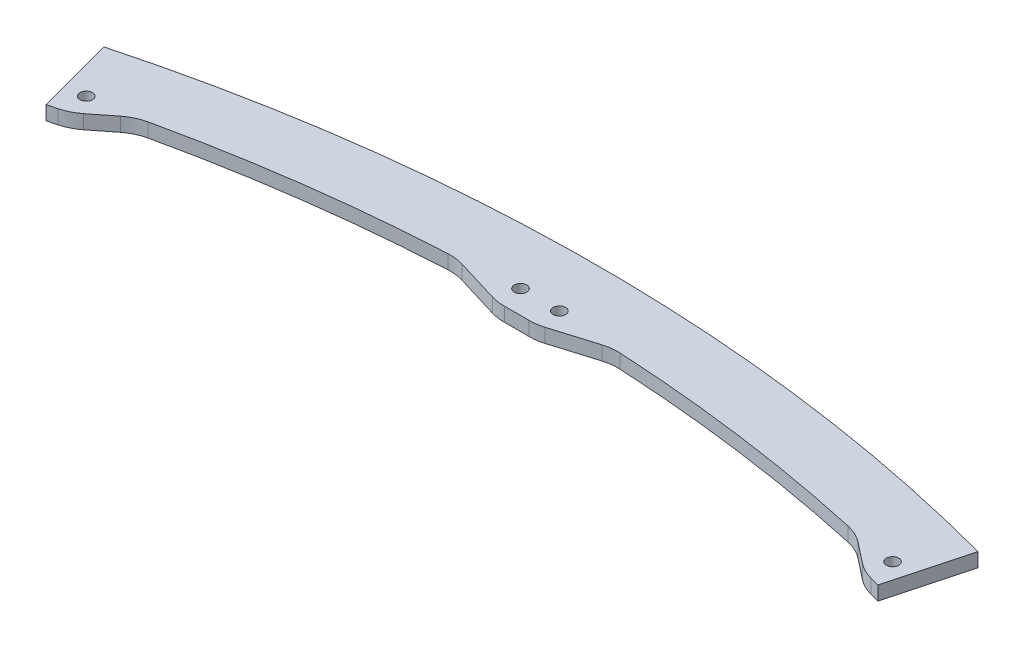
ISO-10303-21;
HEADER;
FILE_DESCRIPTION(('STEP AP214'),'2;1');
FILE_NAME('part.step','',(''),(''),'','','');
FILE_SCHEMA(('AUTOMOTIVE_DESIGN { 1 0 10303 214 1 1 1 1 }'));
ENDSEC;
DATA;
#1=APPLICATION_CONTEXT('core data for automotive mechanical design processes');
#2=APPLICATION_PROTOCOL_DEFINITION('international standard','automotive_design',2000,#1);
#3=PRODUCT_CONTEXT('',#1,'mechanical');
#4=PRODUCT('Part','Part','',(#3));
#5=PRODUCT_RELATED_PRODUCT_CATEGORY('part','',(#4));
#6=PRODUCT_DEFINITION_FORMATION('','',#4);
#7=PRODUCT_DEFINITION_CONTEXT('part definition',#1,'design');
#8=PRODUCT_DEFINITION('design','',#6,#7);
#9=PRODUCT_DEFINITION_SHAPE('','',#8);
#10=(LENGTH_UNIT() NAMED_UNIT(*) SI_UNIT(.MILLI.,.METRE.));
#11=(NAMED_UNIT(*) PLANE_ANGLE_UNIT() SI_UNIT($,.RADIAN.));
#12=(NAMED_UNIT(*) SI_UNIT($,.STERADIAN.) SOLID_ANGLE_UNIT());
#13=UNCERTAINTY_MEASURE_WITH_UNIT(LENGTH_MEASURE(1.E-05),#10,'distance_accuracy_value','');
#14=(GEOMETRIC_REPRESENTATION_CONTEXT(3) GLOBAL_UNCERTAINTY_ASSIGNED_CONTEXT((#13)) GLOBAL_UNIT_ASSIGNED_CONTEXT((#10,
#11,#12)) REPRESENTATION_CONTEXT('',''));
#15=CARTESIAN_POINT('',(0.,0.,0.));
#16=DIRECTION('',(0.,0.,1.));
#17=DIRECTION('',(1.,0.,0.));
#18=AXIS2_PLACEMENT_3D('',#15,#16,#17);
#19=CARTESIAN_POINT('',(0.,9.00000000000001,0.));
#20=DIRECTION('',(0.,-1.,0.));
#21=DIRECTION('',(0.,0.,-1.));
#22=AXIS2_PLACEMENT_3D('',#19,#20,#21);
#23=CYLINDRICAL_SURFACE('',#22,1045.);
#24=CARTESIAN_POINT('',(0.,0.,0.));
#25=DIRECTION('',(0.,1.,0.));
#26=DIRECTION('',(0.,0.,1.));
#27=AXIS2_PLACEMENT_3D('',#24,#25,#26);
#28=CIRCLE('',#27,1045.);
#29=CARTESIAN_POINT('',(224.875525166648,0.,-1020.51751488204));
#30=VERTEX_POINT('',#29);
#31=CARTESIAN_POINT('',(55.2967292869398,0.,-1043.53594654433));
#32=VERTEX_POINT('',#31);
#33=EDGE_CURVE('E271',#30,#32,#28,.T.);
#34=ORIENTED_EDGE('',*,*,#33,.F.);
#35=DIRECTION('',(0.,-1.,0.));
#36=VECTOR('',#35,1.);
#37=CARTESIAN_POINT('',(224.875525166648,9.00000000000001,-1020.51751488204));
#38=LINE('',#37,#36);
#39=CARTESIAN_POINT('',(224.875525166648,9.00000000000001,-1020.51751488204));
#40=VERTEX_POINT('',#39);
#41=EDGE_CURVE('E365',#30,#40,#38,.F.);
#42=ORIENTED_EDGE('',*,*,#41,.T.);
#43=CARTESIAN_POINT('',(0.,9.00000000000001,0.));
#44=DIRECTION('',(0.,1.,0.));
#45=DIRECTION('',(0.,0.,1.));
#46=AXIS2_PLACEMENT_3D('',#43,#44,#45);
#47=CIRCLE('',#46,1045.);
#48=CARTESIAN_POINT('',(55.2967292869398,9.00000000000001,-1043.53594654433));
#49=VERTEX_POINT('',#48);
#50=EDGE_CURVE('E321',#40,#49,#47,.T.);
#51=ORIENTED_EDGE('',*,*,#50,.T.);
#52=DIRECTION('',(0.,-1.,0.));
#53=VECTOR('',#52,1.);
#54=CARTESIAN_POINT('',(55.2967292869398,9.00000000000001,-1043.53594654433));
#55=LINE('',#54,#53);
#56=EDGE_CURVE('E361',#49,#32,#55,.T.);
#57=ORIENTED_EDGE('',*,*,#56,.T.);
#58=EDGE_LOOP('',(#34,#42,#51,#57));
#59=FACE_BOUND('',#58,.T.);
#60=ADVANCED_FACE('F51',(#59),#23,.F.);
#61=CARTESIAN_POINT('',(584.131477744867,9.00000000000001,-741.205658761959));
#62=DIRECTION('',(-0.618971116181871,0.,0.785413749136446));
#63=DIRECTION('',(0.785413749136446,0.,0.618971116181871));
#64=AXIS2_PLACEMENT_3D('',#61,#62,#63);
#65=PLANE('',#64);
#66=DIRECTION('',(-0.785413749136446,0.,-0.618971116181871));
#67=VECTOR('',#66,1.);
#68=CARTESIAN_POINT('',(584.131477744867,0.,-741.205658761959));
#69=LINE('',#68,#67);
#70=CARTESIAN_POINT('',(250.180034810631,0.,-1004.38706806479));
#71=VERTEX_POINT('',#70);
#72=CARTESIAN_POINT('',(236.988901948755,0.,-1014.78277381885));
#73=VERTEX_POINT('',#72);
#74=EDGE_CURVE('E272',#71,#73,#69,.T.);
#75=ORIENTED_EDGE('',*,*,#74,.F.);
#76=DIRECTION('',(0.,1.,0.));
#77=VECTOR('',#76,1.);
#78=CARTESIAN_POINT('',(250.180034810631,9.00000000000001,-1004.38706806479));
#79=LINE('',#78,#77);
#80=CARTESIAN_POINT('',(250.180034810631,9.00000000000001,-1004.38706806479));
#81=VERTEX_POINT('',#80);
#82=EDGE_CURVE('E348',#71,#81,#79,.T.);
#83=ORIENTED_EDGE('',*,*,#82,.T.);
#84=DIRECTION('',(-0.785413749136446,0.,-0.618971116181871));
#85=VECTOR('',#84,1.);
#86=CARTESIAN_POINT('',(584.131477744867,9.00000000000001,-741.205658761959));
#87=LINE('',#86,#85);
#88=CARTESIAN_POINT('',(236.988901948755,9.00000000000001,-1014.78277381885));
#89=VERTEX_POINT('',#88);
#90=EDGE_CURVE('E202',#81,#89,#87,.T.);
#91=ORIENTED_EDGE('',*,*,#90,.T.);
#92=DIRECTION('',(0.,1.,0.));
#93=VECTOR('',#92,1.);
#94=CARTESIAN_POINT('',(236.988901948755,0.,-1014.78277381885));
#95=LINE('',#94,#93);
#96=EDGE_CURVE('E344',#89,#73,#95,.F.);
#97=ORIENTED_EDGE('',*,*,#96,.T.);
#98=EDGE_LOOP('',(#75,#83,#91,#97));
#99=FACE_BOUND('',#98,.T.);
#100=ADVANCED_FACE('F509',(#99),#65,.T.);
#101=CARTESIAN_POINT('',(0.,9.00000000000001,0.));
#102=DIRECTION('',(0.,-1.,0.));
#103=DIRECTION('',(0.,0.,-1.));
#104=AXIS2_PLACEMENT_3D('',#101,#102,#103);
#105=CYLINDRICAL_SURFACE('',#104,1032.5);
#106=CARTESIAN_POINT('',(0.,9.00000000000001,0.));
#107=DIRECTION('',(0.,1.,0.));
#108=DIRECTION('',(0.,0.,1.));
#109=AXIS2_PLACEMENT_3D('',#106,#107,#108);
#110=CIRCLE('',#109,1032.5);
#111=CARTESIAN_POINT('',(261.160956485374,9.00000000000001,-998.925024617786));
#112=VERTEX_POINT('',#111);
#113=CARTESIAN_POINT('',(267.230664068346,9.00000000000001,-997.318415643465));
#114=VERTEX_POINT('',#113);
#115=EDGE_CURVE('E188',#112,#114,#110,.F.);
#116=ORIENTED_EDGE('',*,*,#115,.F.);
#117=DIRECTION('',(0.,-1.,0.));
#118=VECTOR('',#117,1.);
#119=CARTESIAN_POINT('',(261.160956485374,9.00000000000001,-998.925024617786));
#120=LINE('',#119,#118);
#121=CARTESIAN_POINT('',(261.160956485374,0.,-998.925024617786));
#122=VERTEX_POINT('',#121);
#123=EDGE_CURVE('E212',#112,#122,#120,.T.);
#124=ORIENTED_EDGE('',*,*,#123,.T.);
#125=CARTESIAN_POINT('',(0.,0.,0.));
#126=DIRECTION('',(0.,1.,0.));
#127=DIRECTION('',(0.,0.,1.));
#128=AXIS2_PLACEMENT_3D('',#125,#126,#127);
#129=CIRCLE('',#128,1032.5);
#130=CARTESIAN_POINT('',(267.230664068346,0.,-997.318415643465));
#131=VERTEX_POINT('',#130);
#132=EDGE_CURVE('E208',#122,#131,#129,.F.);
#133=ORIENTED_EDGE('',*,*,#132,.T.);
#134=DIRECTION('',(0.,-1.,0.));
#135=VECTOR('',#134,1.);
#136=CARTESIAN_POINT('',(267.230664068346,9.00000000000001,-997.318415643465));
#137=LINE('',#136,#135);
#138=EDGE_CURVE('E205',#114,#131,#137,.T.);
#139=ORIENTED_EDGE('',*,*,#138,.F.);
#140=EDGE_LOOP('',(#116,#124,#133,#139));
#141=FACE_BOUND('',#140,.T.);
#142=ADVANCED_FACE('F206',(#141),#105,.F.);
#143=CARTESIAN_POINT('',(0.,9.00000000000001,0.));
#144=DIRECTION('',(-0.96592582628907,0.,-0.258819045102515));
#145=DIRECTION('',(-0.258819045102515,0.,0.96592582628907));
#146=AXIS2_PLACEMENT_3D('',#143,#144,#145);
#147=PLANE('',#146);
#148=DIRECTION('',(0.258819045102515,0.,-0.96592582628907));
#149=VECTOR('',#148,1.);
#150=CARTESIAN_POINT('',(0.,0.,0.));
#151=LINE('',#150,#149);
#152=CARTESIAN_POINT('',(280.818663936228,0.,-1048.02952152364));
#153=VERTEX_POINT('',#152);
#154=EDGE_CURVE('E278',#131,#153,#151,.T.);
#155=ORIENTED_EDGE('',*,*,#154,.T.);
#156=DIRECTION('',(0.,-1.,0.));
#157=VECTOR('',#156,1.);
#158=CARTESIAN_POINT('',(280.818663936228,9.00000000000001,-1048.02952152364));
#159=LINE('',#158,#157);
#160=CARTESIAN_POINT('',(280.818663936228,9.00000000000001,-1048.02952152364));
#161=VERTEX_POINT('',#160);
#162=EDGE_CURVE('E213',#161,#153,#159,.T.);
#163=ORIENTED_EDGE('',*,*,#162,.F.);
#164=DIRECTION('',(0.258819045102515,0.,-0.96592582628907));
#165=VECTOR('',#164,1.);
#166=CARTESIAN_POINT('',(0.,9.00000000000001,0.));
#167=LINE('',#166,#165);
#168=EDGE_CURVE('E194',#114,#161,#167,.T.);
#169=ORIENTED_EDGE('',*,*,#168,.F.);
#170=ORIENTED_EDGE('',*,*,#138,.T.);
#171=EDGE_LOOP('',(#155,#163,#169,#170));
#172=FACE_BOUND('',#171,.T.);
#173=ADVANCED_FACE('F215',(#172),#147,.F.);
#174=CARTESIAN_POINT('',(0.,9.00000000000001,0.));
#175=DIRECTION('',(0.,-1.,0.));
#176=DIRECTION('',(0.,0.,-1.));
#177=AXIS2_PLACEMENT_3D('',#174,#175,#176);
#178=CYLINDRICAL_SURFACE('',#177,1085.);
#179=CARTESIAN_POINT('',(0.,0.,0.));
#180=DIRECTION('',(0.,1.,0.));
#181=DIRECTION('',(0.,0.,1.));
#182=AXIS2_PLACEMENT_3D('',#179,#180,#181);
#183=CIRCLE('',#182,1085.);
#184=CARTESIAN_POINT('',(-280.818663936228,0.,-1048.02952152364));
#185=VERTEX_POINT('',#184);
#186=EDGE_CURVE('E281',#153,#185,#183,.T.);
#187=ORIENTED_EDGE('',*,*,#186,.T.);
#188=DIRECTION('',(0.,-1.,0.));
#189=VECTOR('',#188,1.);
#190=CARTESIAN_POINT('',(-280.818663936228,9.00000000000001,-1048.02952152364));
#191=LINE('',#190,#189);
#192=CARTESIAN_POINT('',(-280.818663936228,9.00000000000001,-1048.02952152364));
#193=VERTEX_POINT('',#192);
#194=EDGE_CURVE('E325',#193,#185,#191,.T.);
#195=ORIENTED_EDGE('',*,*,#194,.F.);
#196=CARTESIAN_POINT('',(0.,9.00000000000001,0.));
#197=DIRECTION('',(0.,1.,0.));
#198=DIRECTION('',(0.,0.,1.));
#199=AXIS2_PLACEMENT_3D('',#196,#197,#198);
#200=CIRCLE('',#199,1085.);
#201=EDGE_CURVE('E219',#161,#193,#200,.T.);
#202=ORIENTED_EDGE('',*,*,#201,.F.);
#203=ORIENTED_EDGE('',*,*,#162,.T.);
#204=EDGE_LOOP('',(#187,#195,#202,#203));
#205=FACE_BOUND('',#204,.T.);
#206=ADVANCED_FACE('F499',(#205),#178,.T.);
#207=CARTESIAN_POINT('',(0.,9.00000000000001,0.));
#208=DIRECTION('',(-0.96592582628907,0.,0.258819045102515));
#209=DIRECTION('',(0.258819045102515,0.,0.96592582628907));
#210=AXIS2_PLACEMENT_3D('',#207,#208,#209);
#211=PLANE('',#210);
#212=DIRECTION('',(-0.258819045102515,0.,-0.96592582628907));
#213=VECTOR('',#212,1.);
#214=CARTESIAN_POINT('',(0.,0.,0.));
#215=LINE('',#214,#213);
#216=CARTESIAN_POINT('',(-267.230664068346,0.,-997.318415643465));
#217=VERTEX_POINT('',#216);
#218=EDGE_CURVE('E285',#217,#185,#215,.T.);
#219=ORIENTED_EDGE('',*,*,#218,.F.);
#220=DIRECTION('',(0.,-1.,0.));
#221=VECTOR('',#220,1.);
#222=CARTESIAN_POINT('',(-267.230664068346,9.00000000000001,-997.318415643465));
#223=LINE('',#222,#221);
#224=CARTESIAN_POINT('',(-267.230664068346,9.00000000000001,-997.318415643465));
#225=VERTEX_POINT('',#224);
#226=EDGE_CURVE('E264',#225,#217,#223,.T.);
#227=ORIENTED_EDGE('',*,*,#226,.F.);
#228=DIRECTION('',(-0.258819045102515,0.,-0.96592582628907));
#229=VECTOR('',#228,1.);
#230=CARTESIAN_POINT('',(0.,9.00000000000001,0.));
#231=LINE('',#230,#229);
#232=EDGE_CURVE('E223',#225,#193,#231,.T.);
#233=ORIENTED_EDGE('',*,*,#232,.T.);
#234=ORIENTED_EDGE('',*,*,#194,.T.);
#235=EDGE_LOOP('',(#219,#227,#233,#234));
#236=FACE_BOUND('',#235,.T.);
#237=ADVANCED_FACE('F495',(#236),#211,.T.);
#238=CARTESIAN_POINT('',(0.,9.00000000000001,0.));
#239=DIRECTION('',(0.,-1.,0.));
#240=DIRECTION('',(0.,0.,-1.));
#241=AXIS2_PLACEMENT_3D('',#238,#239,#240);
#242=CYLINDRICAL_SURFACE('',#241,1032.5);
#243=CARTESIAN_POINT('',(0.,0.,0.));
#244=DIRECTION('',(0.,1.,0.));
#245=DIRECTION('',(0.,0.,1.));
#246=AXIS2_PLACEMENT_3D('',#243,#244,#245);
#247=CIRCLE('',#246,1032.5);
#248=CARTESIAN_POINT('',(-261.160956485374,0.,-998.925024617786));
#249=VERTEX_POINT('',#248);
#250=EDGE_CURVE('E289',#249,#217,#247,.T.);
#251=ORIENTED_EDGE('',*,*,#250,.F.);
#252=DIRECTION('',(0.,-1.,0.));
#253=VECTOR('',#252,1.);
#254=CARTESIAN_POINT('',(-261.160956485374,9.00000000000001,-998.925024617786));
#255=LINE('',#254,#253);
#256=CARTESIAN_POINT('',(-261.160956485374,9.00000000000001,-998.925024617786));
#257=VERTEX_POINT('',#256);
#258=EDGE_CURVE('E375',#249,#257,#255,.F.);
#259=ORIENTED_EDGE('',*,*,#258,.T.);
#260=CARTESIAN_POINT('',(0.,9.00000000000001,0.));
#261=DIRECTION('',(0.,1.,0.));
#262=DIRECTION('',(0.,0.,1.));
#263=AXIS2_PLACEMENT_3D('',#260,#261,#262);
#264=CIRCLE('',#263,1032.5);
#265=EDGE_CURVE('E230',#257,#225,#264,.T.);
#266=ORIENTED_EDGE('',*,*,#265,.T.);
#267=ORIENTED_EDGE('',*,*,#226,.T.);
#268=EDGE_LOOP('',(#251,#259,#266,#267));
#269=FACE_BOUND('',#268,.T.);
#270=ADVANCED_FACE('F489',(#269),#242,.F.);
#271=CARTESIAN_POINT('',(-584.131477744867,9.00000000000001,-741.205658761959));
#272=DIRECTION('',(-0.618971116181871,0.,-0.785413749136446));
#273=DIRECTION('',(-0.785413749136446,0.,0.618971116181871));
#274=AXIS2_PLACEMENT_3D('',#271,#272,#273);
#275=PLANE('',#274);
#276=DIRECTION('',(0.785413749136446,0.,-0.618971116181871));
#277=VECTOR('',#276,1.);
#278=CARTESIAN_POINT('',(-584.131477744867,9.00000000000001,-741.205658761959));
#279=LINE('',#278,#277);
#280=CARTESIAN_POINT('',(-250.180034810631,9.00000000000001,-1004.38706806479));
#281=VERTEX_POINT('',#280);
#282=CARTESIAN_POINT('',(-236.988901948755,9.00000000000001,-1014.78277381885));
#283=VERTEX_POINT('',#282);
#284=EDGE_CURVE('E233',#281,#283,#279,.T.);
#285=ORIENTED_EDGE('',*,*,#284,.F.);
#286=DIRECTION('',(0.,1.,0.));
#287=VECTOR('',#286,1.);
#288=CARTESIAN_POINT('',(-250.180034810631,0.,-1004.38706806479));
#289=LINE('',#288,#287);
#290=CARTESIAN_POINT('',(-250.180034810631,0.,-1004.38706806479));
#291=VERTEX_POINT('',#290);
#292=EDGE_CURVE('E371',#281,#291,#289,.F.);
#293=ORIENTED_EDGE('',*,*,#292,.T.);
#294=DIRECTION('',(0.785413749136446,0.,-0.618971116181871));
#295=VECTOR('',#294,1.);
#296=CARTESIAN_POINT('',(-584.131477744867,0.,-741.205658761959));
#297=LINE('',#296,#295);
#298=CARTESIAN_POINT('',(-236.988901948755,0.,-1014.78277381885));
#299=VERTEX_POINT('',#298);
#300=EDGE_CURVE('E270',#291,#299,#297,.T.);
#301=ORIENTED_EDGE('',*,*,#300,.T.);
#302=DIRECTION('',(0.,-1.,0.));
#303=VECTOR('',#302,1.);
#304=CARTESIAN_POINT('',(-236.988901948755,9.00000000000001,-1014.78277381885));
#305=LINE('',#304,#303);
#306=EDGE_CURVE('E368',#299,#283,#305,.F.);
#307=ORIENTED_EDGE('',*,*,#306,.T.);
#308=EDGE_LOOP('',(#285,#293,#301,#307));
#309=FACE_BOUND('',#308,.T.);
#310=ADVANCED_FACE('F481',(#309),#275,.F.);
#311=CARTESIAN_POINT('',(-55.2967292869392,9.00000000000001,-1043.53594654433));
#312=VERTEX_POINT('',#311);
#313=CARTESIAN_POINT('',(-224.875525166648,9.00000000000001,-1020.51751488204));
#314=VERTEX_POINT('',#313);
#315=EDGE_CURVE('E237',#312,#314,#47,.T.);
#316=ORIENTED_EDGE('',*,*,#315,.T.);
#317=DIRECTION('',(0.,-1.,0.));
#318=VECTOR('',#317,1.);
#319=CARTESIAN_POINT('',(-224.875525166648,9.00000000000001,-1020.51751488204));
#320=LINE('',#319,#318);
#321=CARTESIAN_POINT('',(-224.875525166648,0.,-1020.51751488204));
#322=VERTEX_POINT('',#321);
#323=EDGE_CURVE('E381',#314,#322,#320,.T.);
#324=ORIENTED_EDGE('',*,*,#323,.T.);
#325=CARTESIAN_POINT('',(-55.2967292869392,0.,-1043.53594654433));
#326=VERTEX_POINT('',#325);
#327=EDGE_CURVE('E265',#326,#322,#28,.T.);
#328=ORIENTED_EDGE('',*,*,#327,.F.);
#329=DIRECTION('',(0.,-1.,0.));
#330=VECTOR('',#329,1.);
#331=CARTESIAN_POINT('',(-55.2967292869392,9.00000000000001,-1043.53594654433));
#332=LINE('',#331,#330);
#333=EDGE_CURVE('E378',#326,#312,#332,.F.);
#334=ORIENTED_EDGE('',*,*,#333,.T.);
#335=EDGE_LOOP('',(#316,#324,#328,#334));
#336=FACE_BOUND('',#335,.T.);
#337=ADVANCED_FACE('F434',(#336),#23,.F.);
#338=CARTESIAN_POINT('',(285.807624714339,9.00000000000001,-941.907369258203));
#339=DIRECTION('',(-0.290362031140912,0.,0.956916867273079));
#340=DIRECTION('',(0.956916867273079,0.,0.290362031140912));
#341=AXIS2_PLACEMENT_3D('',#338,#339,#340);
#342=PLANE('',#341);
#343=DIRECTION('',(-0.956916867273079,0.,-0.290362031140912));
#344=VECTOR('',#343,1.);
#345=CARTESIAN_POINT('',(285.807624714339,9.00000000000001,-941.907369258203));
#346=LINE('',#345,#344);
#347=CARTESIAN_POINT('',(-16.9047879137119,9.00000000000001,-1033.76089801115));
#348=VERTEX_POINT('',#347);
#349=CARTESIAN_POINT('',(-44.998402440168,9.00000000000001,-1042.28548280527));
#350=VERTEX_POINT('',#349);
#351=EDGE_CURVE('E238',#348,#350,#346,.T.);
#352=ORIENTED_EDGE('',*,*,#351,.T.);
#353=DIRECTION('',(0.,1.,0.));
#354=VECTOR('',#353,1.);
#355=CARTESIAN_POINT('',(-44.998402440168,0.,-1042.28548280527));
#356=LINE('',#355,#354);
#357=CARTESIAN_POINT('',(-44.998402440168,0.,-1042.28548280527));
#358=VERTEX_POINT('',#357);
#359=EDGE_CURVE('E394',#350,#358,#356,.F.);
#360=ORIENTED_EDGE('',*,*,#359,.T.);
#361=DIRECTION('',(-0.956916867273079,0.,-0.290362031140912));
#362=VECTOR('',#361,1.);
#363=CARTESIAN_POINT('',(285.807624714339,0.,-941.907369258203));
#364=LINE('',#363,#362);
#365=CARTESIAN_POINT('',(-16.9047879137119,0.,-1033.76089801115));
#366=VERTEX_POINT('',#365);
#367=EDGE_CURVE('E269',#366,#358,#364,.T.);
#368=ORIENTED_EDGE('',*,*,#367,.F.);
#369=DIRECTION('',(0.,1.,0.));
#370=VECTOR('',#369,1.);
#371=CARTESIAN_POINT('',(-16.9047879137119,9.00000000000001,-1033.76089801115));
#372=LINE('',#371,#370);
#373=EDGE_CURVE('E391',#366,#348,#372,.T.);
#374=ORIENTED_EDGE('',*,*,#373,.T.);
#375=EDGE_LOOP('',(#352,#360,#368,#374));
#376=FACE_BOUND('',#375,.T.);
#377=ADVANCED_FACE('F442',(#376),#342,.T.);
#378=CARTESIAN_POINT('',(0.,9.00000000000001,0.));
#379=DIRECTION('',(0.,-1.,0.));
#380=DIRECTION('',(0.,0.,-1.));
#381=AXIS2_PLACEMENT_3D('',#378,#379,#380);
#382=CYLINDRICAL_SURFACE('',#381,1032.5);
#383=CARTESIAN_POINT('',(0.,9.00000000000001,0.));
#384=DIRECTION('',(0.,1.,0.));
#385=DIRECTION('',(0.,0.,1.));
#386=AXIS2_PLACEMENT_3D('',#383,#384,#385);
#387=CIRCLE('',#386,1032.5);
#388=CARTESIAN_POINT('',(-7.96256904124029,9.00000000000001,-1032.46929615087));
#389=VERTEX_POINT('',#388);
#390=CARTESIAN_POINT('',(7.96256904124024,9.00000000000001,-1032.46929615087));
#391=VERTEX_POINT('',#390);
#392=EDGE_CURVE('E242',#389,#391,#387,.F.);
#393=ORIENTED_EDGE('',*,*,#392,.F.);
#394=DIRECTION('',(0.,-1.,0.));
#395=VECTOR('',#394,1.);
#396=CARTESIAN_POINT('',(-7.96256904124029,9.00000000000001,-1032.46929615087));
#397=LINE('',#396,#395);
#398=CARTESIAN_POINT('',(-7.96256904124029,0.,-1032.46929615087));
#399=VERTEX_POINT('',#398);
#400=EDGE_CURVE('E401',#389,#399,#397,.T.);
#401=ORIENTED_EDGE('',*,*,#400,.T.);
#402=CARTESIAN_POINT('',(0.,0.,0.));
#403=DIRECTION('',(0.,1.,0.));
#404=DIRECTION('',(0.,0.,1.));
#405=AXIS2_PLACEMENT_3D('',#402,#403,#404);
#406=CIRCLE('',#405,1032.5);
#407=CARTESIAN_POINT('',(7.96256904124024,0.,-1032.46929615087));
#408=VERTEX_POINT('',#407);
#409=EDGE_CURVE('E298',#399,#408,#406,.F.);
#410=ORIENTED_EDGE('',*,*,#409,.T.);
#411=DIRECTION('',(0.,-1.,0.));
#412=VECTOR('',#411,1.);
#413=CARTESIAN_POINT('',(7.96256904124024,9.00000000000001,-1032.46929615087));
#414=LINE('',#413,#412);
#415=EDGE_CURVE('E398',#408,#391,#414,.F.);
#416=ORIENTED_EDGE('',*,*,#415,.T.);
#417=EDGE_LOOP('',(#393,#401,#410,#416));
#418=FACE_BOUND('',#417,.T.);
#419=ADVANCED_FACE('F449',(#418),#382,.F.);
#420=CARTESIAN_POINT('',(-259.019572899284,9.00000000000001,-1014.9704975294));
#421=DIRECTION('',(0.,-1.,0.));
#422=DIRECTION('',(0.,0.,-1.));
#423=AXIS2_PLACEMENT_3D('',#420,#421,#422);
#424=CYLINDRICAL_SURFACE('',#423,3.99999999999999);
#425=CARTESIAN_POINT('',(-259.019572899284,9.00000000000001,-1014.9704975294));
#426=DIRECTION('',(0.,1.,0.));
#427=DIRECTION('',(0.,0.,1.));
#428=AXIS2_PLACEMENT_3D('',#425,#426,#427);
#429=CIRCLE('',#428,3.99999999999999);
#430=CARTESIAN_POINT('',(-259.019572899284,9.00000000000001,-1010.9704975294));
#431=VERTEX_POINT('',#430);
#432=EDGE_CURVE('E256',#431,#431,#429,.T.);
#433=ORIENTED_EDGE('',*,*,#432,.T.);
#434=EDGE_LOOP('',(#433));
#435=FACE_BOUND('',#434,.T.);
#436=CARTESIAN_POINT('',(-259.019572899284,0.,-1014.9704975294));
#437=DIRECTION('',(0.,1.,0.));
#438=DIRECTION('',(0.,0.,1.));
#439=AXIS2_PLACEMENT_3D('',#436,#437,#438);
#440=CIRCLE('',#439,3.99999999999999);
#441=CARTESIAN_POINT('',(-259.019572899284,0.,-1010.9704975294));
#442=VERTEX_POINT('',#441);
#443=EDGE_CURVE('E313',#442,#442,#440,.T.);
#444=ORIENTED_EDGE('',*,*,#443,.F.);
#445=EDGE_LOOP('',(#444));
#446=FACE_BOUND('',#445,.T.);
#447=ADVANCED_FACE('F603',(#435,#446),#424,.F.);
#448=CARTESIAN_POINT('',(259.019572899284,9.00000000000001,-1014.9704975294));
#449=DIRECTION('',(0.,-1.,0.));
#450=DIRECTION('',(0.,0.,-1.));
#451=AXIS2_PLACEMENT_3D('',#448,#449,#450);
#452=CYLINDRICAL_SURFACE('',#451,3.99999999999999);
#453=CARTESIAN_POINT('',(259.019572899284,9.00000000000001,-1014.9704975294));
#454=DIRECTION('',(0.,1.,0.));
#455=DIRECTION('',(0.,0.,1.));
#456=AXIS2_PLACEMENT_3D('',#453,#454,#455);
#457=CIRCLE('',#456,3.99999999999999);
#458=CARTESIAN_POINT('',(259.019572899284,9.00000000000001,-1010.9704975294));
#459=VERTEX_POINT('',#458);
#460=EDGE_CURVE('E252',#459,#459,#457,.F.);
#461=ORIENTED_EDGE('',*,*,#460,.F.);
#462=EDGE_LOOP('',(#461));
#463=FACE_BOUND('',#462,.T.);
#464=CARTESIAN_POINT('',(259.019572899284,0.,-1014.9704975294));
#465=DIRECTION('',(0.,1.,0.));
#466=DIRECTION('',(0.,0.,1.));
#467=AXIS2_PLACEMENT_3D('',#464,#465,#466);
#468=CIRCLE('',#467,3.99999999999999);
#469=CARTESIAN_POINT('',(259.019572899284,0.,-1010.9704975294));
#470=VERTEX_POINT('',#469);
#471=EDGE_CURVE('E309',#470,#470,#468,.F.);
#472=ORIENTED_EDGE('',*,*,#471,.T.);
#473=EDGE_LOOP('',(#472));
#474=FACE_BOUND('',#473,.T.);
#475=ADVANCED_FACE('F612',(#463,#474),#452,.F.);
#476=CARTESIAN_POINT('',(12.5,9.00000000000001,-1047.42541500577));
#477=DIRECTION('',(0.,-1.,0.));
#478=DIRECTION('',(0.,0.,-1.));
#479=AXIS2_PLACEMENT_3D('',#476,#477,#478);
#480=CYLINDRICAL_SURFACE('',#479,4.);
#481=CARTESIAN_POINT('',(12.5,9.00000000000001,-1047.42541500577));
#482=DIRECTION('',(0.,1.,0.));
#483=DIRECTION('',(0.,0.,1.));
#484=AXIS2_PLACEMENT_3D('',#481,#482,#483);
#485=CIRCLE('',#484,4.);
#486=CARTESIAN_POINT('',(12.5,9.00000000000001,-1043.42541500577));
#487=VERTEX_POINT('',#486);
#488=EDGE_CURVE('E248',#487,#487,#485,.F.);
#489=ORIENTED_EDGE('',*,*,#488,.F.);
#490=EDGE_LOOP('',(#489));
#491=FACE_BOUND('',#490,.T.);
#492=CARTESIAN_POINT('',(12.5,0.,-1047.42541500577));
#493=DIRECTION('',(0.,1.,0.));
#494=DIRECTION('',(0.,0.,1.));
#495=AXIS2_PLACEMENT_3D('',#492,#493,#494);
#496=CIRCLE('',#495,4.);
#497=CARTESIAN_POINT('',(12.5,0.,-1043.42541500577));
#498=VERTEX_POINT('',#497);
#499=EDGE_CURVE('E305',#498,#498,#496,.F.);
#500=ORIENTED_EDGE('',*,*,#499,.T.);
#501=EDGE_LOOP('',(#500));
#502=FACE_BOUND('',#501,.T.);
#503=ADVANCED_FACE('F622',(#491,#502),#480,.F.);
#504=CARTESIAN_POINT('',(-285.807624714334,9.00000000000001,-941.907369258206));
#505=DIRECTION('',(-0.290362031140907,0.,-0.956916867273081));
#506=DIRECTION('',(-0.956916867273081,0.,0.290362031140907));
#507=AXIS2_PLACEMENT_3D('',#504,#505,#506);
#508=PLANE('',#507);
#509=DIRECTION('',(0.956916867273081,0.,-0.290362031140907));
#510=VECTOR('',#509,1.);
#511=CARTESIAN_POINT('',(-285.807624714334,0.,-941.907369258206));
#512=LINE('',#511,#510);
#513=CARTESIAN_POINT('',(16.9047879137117,0.,-1033.76089801115));
#514=VERTEX_POINT('',#513);
#515=CARTESIAN_POINT('',(44.9984024401687,0.,-1042.28548280527));
#516=VERTEX_POINT('',#515);
#517=EDGE_CURVE('E302',#514,#516,#512,.T.);
#518=ORIENTED_EDGE('',*,*,#517,.T.);
#519=DIRECTION('',(0.,-1.,0.));
#520=VECTOR('',#519,1.);
#521=CARTESIAN_POINT('',(44.9984024401687,9.00000000000001,-1042.28548280527));
#522=LINE('',#521,#520);
#523=CARTESIAN_POINT('',(44.9984024401687,9.00000000000001,-1042.28548280527));
#524=VERTEX_POINT('',#523);
#525=EDGE_CURVE('E67',#516,#524,#522,.F.);
#526=ORIENTED_EDGE('',*,*,#525,.T.);
#527=DIRECTION('',(0.956916867273081,0.,-0.290362031140907));
#528=VECTOR('',#527,1.);
#529=CARTESIAN_POINT('',(-285.807624714334,9.00000000000001,-941.907369258206));
#530=LINE('',#529,#528);
#531=CARTESIAN_POINT('',(16.9047879137117,9.00000000000001,-1033.76089801115));
#532=VERTEX_POINT('',#531);
#533=EDGE_CURVE('E245',#532,#524,#530,.T.);
#534=ORIENTED_EDGE('',*,*,#533,.F.);
#535=DIRECTION('',(0.,-1.,0.));
#536=VECTOR('',#535,1.);
#537=CARTESIAN_POINT('',(16.9047879137116,9.00000000000001,-1033.76089801115));
#538=LINE('',#537,#536);
#539=EDGE_CURVE('E385',#532,#514,#538,.T.);
#540=ORIENTED_EDGE('',*,*,#539,.T.);
#541=EDGE_LOOP('',(#518,#526,#534,#540));
#542=FACE_BOUND('',#541,.T.);
#543=ADVANCED_FACE('F455',(#542),#508,.F.);
#544=CARTESIAN_POINT('',(-12.5,9.00000000000001,-1047.42541500577));
#545=DIRECTION('',(0.,-1.,0.));
#546=DIRECTION('',(0.,0.,-1.));
#547=AXIS2_PLACEMENT_3D('',#544,#545,#546);
#548=CYLINDRICAL_SURFACE('',#547,4.);
#549=CARTESIAN_POINT('',(-12.5,9.00000000000001,-1047.42541500577));
#550=DIRECTION('',(0.,1.,0.));
#551=DIRECTION('',(0.,0.,1.));
#552=AXIS2_PLACEMENT_3D('',#549,#550,#551);
#553=CIRCLE('',#552,4.);
#554=CARTESIAN_POINT('',(-12.5,9.00000000000001,-1043.42541500577));
#555=VERTEX_POINT('',#554);
#556=EDGE_CURVE('E260',#555,#555,#553,.T.);
#557=ORIENTED_EDGE('',*,*,#556,.T.);
#558=EDGE_LOOP('',(#557));
#559=FACE_BOUND('',#558,.T.);
#560=CARTESIAN_POINT('',(-12.5,0.,-1047.42541500577));
#561=DIRECTION('',(0.,1.,0.));
#562=DIRECTION('',(0.,0.,1.));
#563=AXIS2_PLACEMENT_3D('',#560,#561,#562);
#564=CIRCLE('',#563,4.);
#565=CARTESIAN_POINT('',(-12.5,0.,-1043.42541500577));
#566=VERTEX_POINT('',#565);
#567=EDGE_CURVE('E317',#566,#566,#564,.T.);
#568=ORIENTED_EDGE('',*,*,#567,.F.);
#569=EDGE_LOOP('',(#568));
#570=FACE_BOUND('',#569,.T.);
#571=ADVANCED_FACE('F641',(#559,#570),#548,.F.);
#572=CARTESIAN_POINT('',(0.,9.00000000000001,0.));
#573=DIRECTION('',(0.,1.,0.));
#574=DIRECTION('',(0.,0.,1.));
#575=AXIS2_PLACEMENT_3D('',#572,#573,#574);
#576=PLANE('',#575);
#577=ORIENTED_EDGE('',*,*,#90,.F.);
#578=CARTESIAN_POINT('',(268.749168296087,9.00000000000001,-1027.94948053888));
#579=DIRECTION('',(0.,1.,0.));
#580=DIRECTION('',(0.,0.,1.));
#581=AXIS2_PLACEMENT_3D('',#578,#579,#580);
#582=CIRCLE('',#581,30.);
#583=EDGE_CURVE('E197',#81,#112,#582,.T.);
#584=ORIENTED_EDGE('',*,*,#583,.T.);
#585=ORIENTED_EDGE('',*,*,#115,.T.);
#586=ORIENTED_EDGE('',*,*,#168,.T.);
#587=ORIENTED_EDGE('',*,*,#201,.T.);
#588=ORIENTED_EDGE('',*,*,#232,.F.);
#589=ORIENTED_EDGE('',*,*,#265,.F.);
#590=CARTESIAN_POINT('',(-268.749168296087,9.00000000000001,-1027.94948053888));
#591=DIRECTION('',(0.,1.,0.));
#592=DIRECTION('',(0.,0.,1.));
#593=AXIS2_PLACEMENT_3D('',#590,#591,#592);
#594=CIRCLE('',#593,30.);
#595=EDGE_CURVE('E356',#257,#281,#594,.T.);
#596=ORIENTED_EDGE('',*,*,#595,.T.);
#597=ORIENTED_EDGE('',*,*,#284,.T.);
#598=CARTESIAN_POINT('',(-218.419768463299,9.00000000000001,-991.220361344761));
#599=DIRECTION('',(0.,1.,0.));
#600=DIRECTION('',(0.,0.,1.));
#601=AXIS2_PLACEMENT_3D('',#598,#599,#600);
#602=CIRCLE('',#601,30.);
#603=EDGE_CURVE('E414',#283,#314,#602,.F.);
#604=ORIENTED_EDGE('',*,*,#603,.T.);
#605=ORIENTED_EDGE('',*,*,#315,.F.);
#606=CARTESIAN_POINT('',(-53.7092633743955,9.00000000000001,-1013.57797678707));
#607=DIRECTION('',(0.,1.,0.));
#608=DIRECTION('',(0.,0.,1.));
#609=AXIS2_PLACEMENT_3D('',#606,#607,#608);
#610=CIRCLE('',#609,30.);
#611=EDGE_CURVE('E11',#312,#350,#610,.F.);
#612=ORIENTED_EDGE('',*,*,#611,.T.);
#613=ORIENTED_EDGE('',*,*,#351,.F.);
#614=CARTESIAN_POINT('',(-8.19392697948457,9.00000000000001,-1062.46840402934));
#615=DIRECTION('',(0.,1.,0.));
#616=DIRECTION('',(0.,0.,1.));
#617=AXIS2_PLACEMENT_3D('',#614,#615,#616);
#618=CIRCLE('',#617,30.);
#619=EDGE_CURVE('E353',#348,#389,#618,.T.);
#620=ORIENTED_EDGE('',*,*,#619,.T.);
#621=ORIENTED_EDGE('',*,*,#392,.T.);
#622=CARTESIAN_POINT('',(8.19392697948451,9.00000000000001,-1062.46840402934));
#623=DIRECTION('',(0.,1.,0.));
#624=DIRECTION('',(0.,0.,1.));
#625=AXIS2_PLACEMENT_3D('',#622,#623,#624);
#626=CIRCLE('',#625,30.);
#627=EDGE_CURVE('E74',#391,#532,#626,.T.);
#628=ORIENTED_EDGE('',*,*,#627,.T.);
#629=ORIENTED_EDGE('',*,*,#533,.T.);
#630=CARTESIAN_POINT('',(53.7092633743961,9.00000000000001,-1013.57797678707));
#631=DIRECTION('',(0.,1.,0.));
#632=DIRECTION('',(0.,0.,1.));
#633=AXIS2_PLACEMENT_3D('',#630,#631,#632);
#634=CIRCLE('',#633,30.);
#635=EDGE_CURVE('E420',#524,#49,#634,.F.);
#636=ORIENTED_EDGE('',*,*,#635,.T.);
#637=ORIENTED_EDGE('',*,*,#50,.F.);
#638=CARTESIAN_POINT('',(218.419768463299,9.00000000000001,-991.220361344761));
#639=DIRECTION('',(0.,1.,0.));
#640=DIRECTION('',(0.,0.,1.));
#641=AXIS2_PLACEMENT_3D('',#638,#639,#640);
#642=CIRCLE('',#641,30.);
#643=EDGE_CURVE('E408',#40,#89,#642,.F.);
#644=ORIENTED_EDGE('',*,*,#643,.T.);
#645=EDGE_LOOP('',(#577,#584,#585,#586,#587,#588,#589,#596,#597,#604,#605,#612,#613,#620,#621,
#628,#629,#636,#637,#644));
#646=FACE_BOUND('',#645,.T.);
#647=ORIENTED_EDGE('',*,*,#488,.T.);
#648=EDGE_LOOP('',(#647));
#649=FACE_BOUND('',#648,.T.);
#650=ORIENTED_EDGE('',*,*,#460,.T.);
#651=EDGE_LOOP('',(#650));
#652=FACE_BOUND('',#651,.T.);
#653=ORIENTED_EDGE('',*,*,#432,.F.);
#654=EDGE_LOOP('',(#653));
#655=FACE_BOUND('',#654,.T.);
#656=ORIENTED_EDGE('',*,*,#556,.F.);
#657=EDGE_LOOP('',(#656));
#658=FACE_BOUND('',#657,.T.);
#659=ADVANCED_FACE('F191',(#646,#649,#652,#655,#658),#576,.T.);
#660=CARTESIAN_POINT('',(0.,0.,0.));
#661=DIRECTION('',(0.,1.,0.));
#662=DIRECTION('',(0.,0.,1.));
#663=AXIS2_PLACEMENT_3D('',#660,#661,#662);
#664=PLANE('',#663);
#665=ORIENTED_EDGE('',*,*,#132,.F.);
#666=CARTESIAN_POINT('',(268.749168296087,0.,-1027.94948053888));
#667=DIRECTION('',(0.,1.,0.));
#668=DIRECTION('',(0.,0.,1.));
#669=AXIS2_PLACEMENT_3D('',#666,#667,#668);
#670=CIRCLE('',#669,30.);
#671=EDGE_CURVE('E341',#122,#71,#670,.F.);
#672=ORIENTED_EDGE('',*,*,#671,.T.);
#673=ORIENTED_EDGE('',*,*,#74,.T.);
#674=CARTESIAN_POINT('',(218.419768463299,0.,-991.220361344761));
#675=DIRECTION('',(0.,1.,0.));
#676=DIRECTION('',(0.,0.,1.));
#677=AXIS2_PLACEMENT_3D('',#674,#675,#676);
#678=CIRCLE('',#677,30.);
#679=EDGE_CURVE('E405',#73,#30,#678,.T.);
#680=ORIENTED_EDGE('',*,*,#679,.T.);
#681=ORIENTED_EDGE('',*,*,#33,.T.);
#682=CARTESIAN_POINT('',(53.7092633743961,0.,-1013.57797678707));
#683=DIRECTION('',(0.,1.,0.));
#684=DIRECTION('',(0.,0.,1.));
#685=AXIS2_PLACEMENT_3D('',#682,#683,#684);
#686=CIRCLE('',#685,30.);
#687=EDGE_CURVE('E417',#32,#516,#686,.T.);
#688=ORIENTED_EDGE('',*,*,#687,.T.);
#689=ORIENTED_EDGE('',*,*,#517,.F.);
#690=CARTESIAN_POINT('',(8.19392697948451,0.,-1062.46840402934));
#691=DIRECTION('',(0.,1.,0.));
#692=DIRECTION('',(0.,0.,1.));
#693=AXIS2_PLACEMENT_3D('',#690,#691,#692);
#694=CIRCLE('',#693,30.);
#695=EDGE_CURVE('E332',#514,#408,#694,.F.);
#696=ORIENTED_EDGE('',*,*,#695,.T.);
#697=ORIENTED_EDGE('',*,*,#409,.F.);
#698=CARTESIAN_POINT('',(-8.19392697948457,0.,-1062.46840402934));
#699=DIRECTION('',(0.,1.,0.));
#700=DIRECTION('',(0.,0.,1.));
#701=AXIS2_PLACEMENT_3D('',#698,#699,#700);
#702=CIRCLE('',#701,30.);
#703=EDGE_CURVE('E335',#399,#366,#702,.F.);
#704=ORIENTED_EDGE('',*,*,#703,.T.);
#705=ORIENTED_EDGE('',*,*,#367,.T.);
#706=CARTESIAN_POINT('',(-53.7092633743955,0.,-1013.57797678707));
#707=DIRECTION('',(0.,1.,0.));
#708=DIRECTION('',(0.,0.,1.));
#709=AXIS2_PLACEMENT_3D('',#706,#707,#708);
#710=CIRCLE('',#709,30.);
#711=EDGE_CURVE('E60',#358,#326,#710,.T.);
#712=ORIENTED_EDGE('',*,*,#711,.T.);
#713=ORIENTED_EDGE('',*,*,#327,.T.);
#714=CARTESIAN_POINT('',(-218.419768463299,0.,-991.220361344761));
#715=DIRECTION('',(0.,1.,0.));
#716=DIRECTION('',(0.,0.,1.));
#717=AXIS2_PLACEMENT_3D('',#714,#715,#716);
#718=CIRCLE('',#717,30.);
#719=EDGE_CURVE('E411',#322,#299,#718,.T.);
#720=ORIENTED_EDGE('',*,*,#719,.T.);
#721=ORIENTED_EDGE('',*,*,#300,.F.);
#722=CARTESIAN_POINT('',(-268.749168296087,0.,-1027.94948053888));
#723=DIRECTION('',(0.,1.,0.));
#724=DIRECTION('',(0.,0.,1.));
#725=AXIS2_PLACEMENT_3D('',#722,#723,#724);
#726=CIRCLE('',#725,30.);
#727=EDGE_CURVE('E338',#291,#249,#726,.F.);
#728=ORIENTED_EDGE('',*,*,#727,.T.);
#729=ORIENTED_EDGE('',*,*,#250,.T.);
#730=ORIENTED_EDGE('',*,*,#218,.T.);
#731=ORIENTED_EDGE('',*,*,#186,.F.);
#732=ORIENTED_EDGE('',*,*,#154,.F.);
#733=EDGE_LOOP('',(#665,#672,#673,#680,#681,#688,#689,#696,#697,#704,#705,#712,#713,#720,#721,
#728,#729,#730,#731,#732));
#734=FACE_BOUND('',#733,.T.);
#735=ORIENTED_EDGE('',*,*,#499,.F.);
#736=EDGE_LOOP('',(#735));
#737=FACE_BOUND('',#736,.T.);
#738=ORIENTED_EDGE('',*,*,#471,.F.);
#739=EDGE_LOOP('',(#738));
#740=FACE_BOUND('',#739,.T.);
#741=ORIENTED_EDGE('',*,*,#443,.T.);
#742=EDGE_LOOP('',(#741));
#743=FACE_BOUND('',#742,.T.);
#744=ORIENTED_EDGE('',*,*,#567,.T.);
#745=EDGE_LOOP('',(#744));
#746=FACE_BOUND('',#745,.T.);
#747=ADVANCED_FACE('F426',(#734,#737,#740,#743,#746),#664,.F.);
#748=CARTESIAN_POINT('',(268.749168296087,9.00000000000001,-1027.94948053888));
#749=DIRECTION('',(0.,-1.,0.));
#750=DIRECTION('',(0.,0.,-1.));
#751=AXIS2_PLACEMENT_3D('',#748,#749,#750);
#752=CYLINDRICAL_SURFACE('',#751,30.);
#753=ORIENTED_EDGE('',*,*,#583,.F.);
#754=ORIENTED_EDGE('',*,*,#82,.F.);
#755=ORIENTED_EDGE('',*,*,#671,.F.);
#756=ORIENTED_EDGE('',*,*,#123,.F.);
#757=EDGE_LOOP('',(#753,#754,#755,#756));
#758=FACE_BOUND('',#757,.T.);
#759=ADVANCED_FACE('F679',(#758),#752,.T.);
#760=CARTESIAN_POINT('',(218.419768463299,9.00000000000001,-991.220361344761));
#761=DIRECTION('',(0.,-1.,0.));
#762=DIRECTION('',(0.,0.,-1.));
#763=AXIS2_PLACEMENT_3D('',#760,#761,#762);
#764=CYLINDRICAL_SURFACE('',#763,30.);
#765=ORIENTED_EDGE('',*,*,#643,.F.);
#766=ORIENTED_EDGE('',*,*,#41,.F.);
#767=ORIENTED_EDGE('',*,*,#679,.F.);
#768=ORIENTED_EDGE('',*,*,#96,.F.);
#769=EDGE_LOOP('',(#765,#766,#767,#768));
#770=FACE_BOUND('',#769,.T.);
#771=ADVANCED_FACE('F700',(#770),#764,.F.);
#772=CARTESIAN_POINT('',(-268.749168296087,9.00000000000001,-1027.94948053888));
#773=DIRECTION('',(0.,-1.,0.));
#774=DIRECTION('',(0.,0.,-1.));
#775=AXIS2_PLACEMENT_3D('',#772,#773,#774);
#776=CYLINDRICAL_SURFACE('',#775,30.);
#777=ORIENTED_EDGE('',*,*,#595,.F.);
#778=ORIENTED_EDGE('',*,*,#258,.F.);
#779=ORIENTED_EDGE('',*,*,#727,.F.);
#780=ORIENTED_EDGE('',*,*,#292,.F.);
#781=EDGE_LOOP('',(#777,#778,#779,#780));
#782=FACE_BOUND('',#781,.T.);
#783=ADVANCED_FACE('F485',(#782),#776,.T.);
#784=CARTESIAN_POINT('',(-218.419768463299,9.00000000000001,-991.220361344761));
#785=DIRECTION('',(0.,-1.,0.));
#786=DIRECTION('',(0.,0.,-1.));
#787=AXIS2_PLACEMENT_3D('',#784,#785,#786);
#788=CYLINDRICAL_SURFACE('',#787,30.);
#789=ORIENTED_EDGE('',*,*,#603,.F.);
#790=ORIENTED_EDGE('',*,*,#306,.F.);
#791=ORIENTED_EDGE('',*,*,#719,.F.);
#792=ORIENTED_EDGE('',*,*,#323,.F.);
#793=EDGE_LOOP('',(#789,#790,#791,#792));
#794=FACE_BOUND('',#793,.T.);
#795=ADVANCED_FACE('F476',(#794),#788,.F.);
#796=CARTESIAN_POINT('',(53.7092633743961,9.00000000000001,-1013.57797678707));
#797=DIRECTION('',(0.,-1.,0.));
#798=DIRECTION('',(0.,0.,-1.));
#799=AXIS2_PLACEMENT_3D('',#796,#797,#798);
#800=CYLINDRICAL_SURFACE('',#799,30.);
#801=ORIENTED_EDGE('',*,*,#635,.F.);
#802=ORIENTED_EDGE('',*,*,#525,.F.);
#803=ORIENTED_EDGE('',*,*,#687,.F.);
#804=ORIENTED_EDGE('',*,*,#56,.F.);
#805=EDGE_LOOP('',(#801,#802,#803,#804));
#806=FACE_BOUND('',#805,.T.);
#807=ADVANCED_FACE('F461',(#806),#800,.F.);
#808=CARTESIAN_POINT('',(-53.7092633743955,9.00000000000001,-1013.57797678707));
#809=DIRECTION('',(0.,-1.,0.));
#810=DIRECTION('',(0.,0.,-1.));
#811=AXIS2_PLACEMENT_3D('',#808,#809,#810);
#812=CYLINDRICAL_SURFACE('',#811,30.);
#813=ORIENTED_EDGE('',*,*,#611,.F.);
#814=ORIENTED_EDGE('',*,*,#333,.F.);
#815=ORIENTED_EDGE('',*,*,#711,.F.);
#816=ORIENTED_EDGE('',*,*,#359,.F.);
#817=EDGE_LOOP('',(#813,#814,#815,#816));
#818=FACE_BOUND('',#817,.T.);
#819=ADVANCED_FACE('F438',(#818),#812,.F.);
#820=CARTESIAN_POINT('',(-8.19392697948457,9.00000000000001,-1062.46840402934));
#821=DIRECTION('',(0.,-1.,0.));
#822=DIRECTION('',(0.,0.,-1.));
#823=AXIS2_PLACEMENT_3D('',#820,#821,#822);
#824=CYLINDRICAL_SURFACE('',#823,30.);
#825=ORIENTED_EDGE('',*,*,#619,.F.);
#826=ORIENTED_EDGE('',*,*,#373,.F.);
#827=ORIENTED_EDGE('',*,*,#703,.F.);
#828=ORIENTED_EDGE('',*,*,#400,.F.);
#829=EDGE_LOOP('',(#825,#826,#827,#828));
#830=FACE_BOUND('',#829,.T.);
#831=ADVANCED_FACE('F445',(#830),#824,.T.);
#832=CARTESIAN_POINT('',(8.19392697948451,9.00000000000001,-1062.46840402934));
#833=DIRECTION('',(0.,-1.,0.));
#834=DIRECTION('',(0.,0.,-1.));
#835=AXIS2_PLACEMENT_3D('',#832,#833,#834);
#836=CYLINDRICAL_SURFACE('',#835,30.);
#837=ORIENTED_EDGE('',*,*,#627,.F.);
#838=ORIENTED_EDGE('',*,*,#415,.F.);
#839=ORIENTED_EDGE('',*,*,#695,.F.);
#840=ORIENTED_EDGE('',*,*,#539,.F.);
#841=EDGE_LOOP('',(#837,#838,#839,#840));
#842=FACE_BOUND('',#841,.T.);
#843=ADVANCED_FACE('F53',(#842),#836,.T.);
#844=CLOSED_SHELL('',(#60,#100,#142,#173,#206,#237,#270,#310,#337,#377,#419,#447,#475,#503,#543,
#571,#659,#747,#759,#771,#783,#795,#807,#819,#831,#843));
#845=MANIFOLD_SOLID_BREP('B2',#844);
#846=ADVANCED_BREP_SHAPE_REPRESENTATION('',(#18,#845),#14);
#847=SHAPE_DEFINITION_REPRESENTATION(#9,#846);
ENDSEC;
END-ISO-10303-21;
